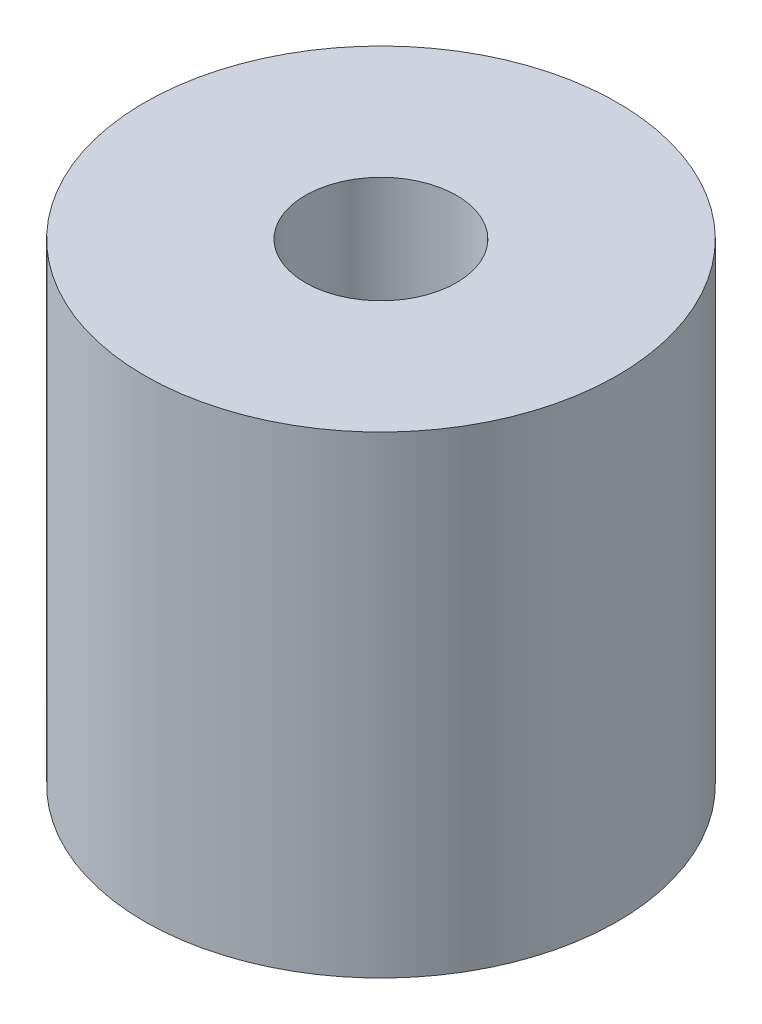
ISO-10303-21;
HEADER;
FILE_DESCRIPTION(('STEP AP214'),'2;1');
FILE_NAME('part.step','',(''),(''),'','','');
FILE_SCHEMA(('AUTOMOTIVE_DESIGN { 1 0 10303 214 1 1 1 1 }'));
ENDSEC;
DATA;
#1=APPLICATION_CONTEXT('core data for automotive mechanical design processes');
#2=APPLICATION_PROTOCOL_DEFINITION('international standard','automotive_design',2000,#1);
#3=PRODUCT_CONTEXT('',#1,'mechanical');
#4=PRODUCT('Part','Part','',(#3));
#5=PRODUCT_RELATED_PRODUCT_CATEGORY('part','',(#4));
#6=PRODUCT_DEFINITION_FORMATION('','',#4);
#7=PRODUCT_DEFINITION_CONTEXT('part definition',#1,'design');
#8=PRODUCT_DEFINITION('design','',#6,#7);
#9=PRODUCT_DEFINITION_SHAPE('','',#8);
#10=(LENGTH_UNIT() NAMED_UNIT(*) SI_UNIT(.MILLI.,.METRE.));
#11=(NAMED_UNIT(*) PLANE_ANGLE_UNIT() SI_UNIT($,.RADIAN.));
#12=(NAMED_UNIT(*) SI_UNIT($,.STERADIAN.) SOLID_ANGLE_UNIT());
#13=UNCERTAINTY_MEASURE_WITH_UNIT(LENGTH_MEASURE(1.E-05),#10,'distance_accuracy_value','');
#14=(GEOMETRIC_REPRESENTATION_CONTEXT(3) GLOBAL_UNCERTAINTY_ASSIGNED_CONTEXT((#13)) GLOBAL_UNIT_ASSIGNED_CONTEXT((#10,
#11,#12)) REPRESENTATION_CONTEXT('',''));
#15=CARTESIAN_POINT('',(0.,0.,0.));
#16=DIRECTION('',(0.,0.,1.));
#17=DIRECTION('',(1.,0.,0.));
#18=AXIS2_PLACEMENT_3D('',#15,#16,#17);
#19=CARTESIAN_POINT('',(0.,10.,0.));
#20=DIRECTION('',(0.,1.,0.));
#21=DIRECTION('',(0.,0.,1.));
#22=AXIS2_PLACEMENT_3D('',#19,#20,#21);
#23=PLANE('',#22);
#24=CARTESIAN_POINT('',(0.,10.,0.));
#25=DIRECTION('',(0.,1.,0.));
#26=DIRECTION('',(0.,0.,1.));
#27=AXIS2_PLACEMENT_3D('',#24,#25,#26);
#28=CIRCLE('',#27,5.);
#29=CARTESIAN_POINT('',(0.,10.,5.));
#30=VERTEX_POINT('',#29);
#31=EDGE_CURVE('E10',#30,#30,#28,.T.);
#32=ORIENTED_EDGE('',*,*,#31,.T.);
#33=EDGE_LOOP('',(#32));
#34=FACE_BOUND('',#33,.T.);
#35=CARTESIAN_POINT('',(0.,10.,0.));
#36=DIRECTION('',(0.,1.,0.));
#37=DIRECTION('',(0.,0.,1.));
#38=AXIS2_PLACEMENT_3D('',#35,#36,#37);
#39=CIRCLE('',#38,1.6);
#40=CARTESIAN_POINT('',(0.,10.,1.6));
#41=VERTEX_POINT('',#40);
#42=EDGE_CURVE('E46',#41,#41,#39,.T.);
#43=ORIENTED_EDGE('',*,*,#42,.F.);
#44=EDGE_LOOP('',(#43));
#45=FACE_BOUND('',#44,.T.);
#46=ADVANCED_FACE('F35',(#34,#45),#23,.T.);
#47=CARTESIAN_POINT('',(0.,0.,0.));
#48=DIRECTION('',(0.,1.,0.));
#49=DIRECTION('',(0.,0.,1.));
#50=AXIS2_PLACEMENT_3D('',#47,#48,#49);
#51=PLANE('',#50);
#52=CARTESIAN_POINT('',(0.,0.,0.));
#53=DIRECTION('',(0.,1.,0.));
#54=DIRECTION('',(0.,0.,1.));
#55=AXIS2_PLACEMENT_3D('',#52,#53,#54);
#56=CIRCLE('',#55,5.);
#57=CARTESIAN_POINT('',(0.,0.,5.));
#58=VERTEX_POINT('',#57);
#59=EDGE_CURVE('E39',#58,#58,#56,.T.);
#60=ORIENTED_EDGE('',*,*,#59,.F.);
#61=EDGE_LOOP('',(#60));
#62=FACE_BOUND('',#61,.T.);
#63=CARTESIAN_POINT('',(0.,0.,0.));
#64=DIRECTION('',(0.,1.,0.));
#65=DIRECTION('',(0.,0.,1.));
#66=AXIS2_PLACEMENT_3D('',#63,#64,#65);
#67=CIRCLE('',#66,1.6);
#68=CARTESIAN_POINT('',(0.,0.,1.6));
#69=VERTEX_POINT('',#68);
#70=EDGE_CURVE('E48',#69,#69,#67,.T.);
#71=ORIENTED_EDGE('',*,*,#70,.T.);
#72=EDGE_LOOP('',(#71));
#73=FACE_BOUND('',#72,.T.);
#74=ADVANCED_FACE('F58',(#62,#73),#51,.F.);
#75=CARTESIAN_POINT('',(0.,10.,0.));
#76=DIRECTION('',(0.,-1.,0.));
#77=DIRECTION('',(0.,0.,-1.));
#78=AXIS2_PLACEMENT_3D('',#75,#76,#77);
#79=CYLINDRICAL_SURFACE('',#78,5.);
#80=ORIENTED_EDGE('',*,*,#31,.F.);
#81=EDGE_LOOP('',(#80));
#82=FACE_BOUND('',#81,.T.);
#83=ORIENTED_EDGE('',*,*,#59,.T.);
#84=EDGE_LOOP('',(#83));
#85=FACE_BOUND('',#84,.T.);
#86=ADVANCED_FACE('F37',(#82,#85),#79,.T.);
#87=CARTESIAN_POINT('',(0.,10.,0.));
#88=DIRECTION('',(0.,-1.,0.));
#89=DIRECTION('',(0.,0.,-1.));
#90=AXIS2_PLACEMENT_3D('',#87,#88,#89);
#91=CYLINDRICAL_SURFACE('',#90,1.6);
#92=ORIENTED_EDGE('',*,*,#42,.T.);
#93=EDGE_LOOP('',(#92));
#94=FACE_BOUND('',#93,.T.);
#95=ORIENTED_EDGE('',*,*,#70,.F.);
#96=EDGE_LOOP('',(#95));
#97=FACE_BOUND('',#96,.T.);
#98=ADVANCED_FACE('F54',(#94,#97),#91,.F.);
#99=CLOSED_SHELL('',(#46,#74,#86,#98));
#100=MANIFOLD_SOLID_BREP('B2',#99);
#101=ADVANCED_BREP_SHAPE_REPRESENTATION('',(#18,#100),#14);
#102=SHAPE_DEFINITION_REPRESENTATION(#9,#101);
ENDSEC;
END-ISO-10303-21;
